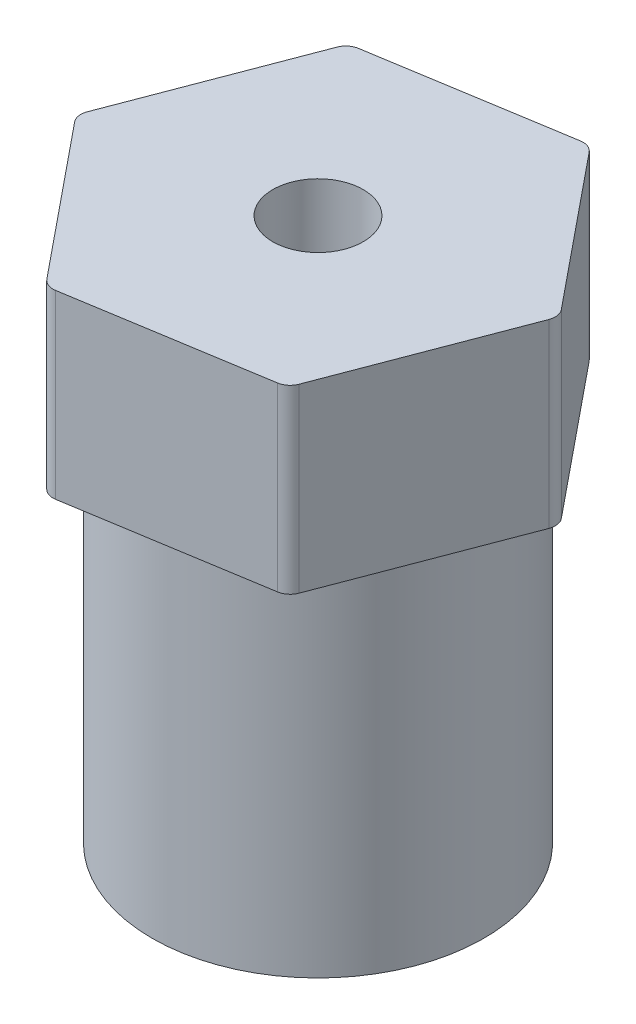
ISO-10303-21;
HEADER;
FILE_DESCRIPTION(('STEP AP214'),'2;1');
FILE_NAME('part.step','',(''),(''),'','','');
FILE_SCHEMA(('AUTOMOTIVE_DESIGN { 1 0 10303 214 1 1 1 1 }'));
ENDSEC;
DATA;
#1=APPLICATION_CONTEXT('core data for automotive mechanical design processes');
#2=APPLICATION_PROTOCOL_DEFINITION('international standard','automotive_design',2000,#1);
#3=PRODUCT_CONTEXT('',#1,'mechanical');
#4=PRODUCT('Part','Part','',(#3));
#5=PRODUCT_RELATED_PRODUCT_CATEGORY('part','',(#4));
#6=PRODUCT_DEFINITION_FORMATION('','',#4);
#7=PRODUCT_DEFINITION_CONTEXT('part definition',#1,'design');
#8=PRODUCT_DEFINITION('design','',#6,#7);
#9=PRODUCT_DEFINITION_SHAPE('','',#8);
#10=(LENGTH_UNIT() NAMED_UNIT(*) SI_UNIT(.MILLI.,.METRE.));
#11=(NAMED_UNIT(*) PLANE_ANGLE_UNIT() SI_UNIT($,.RADIAN.));
#12=(NAMED_UNIT(*) SI_UNIT($,.STERADIAN.) SOLID_ANGLE_UNIT());
#13=UNCERTAINTY_MEASURE_WITH_UNIT(LENGTH_MEASURE(1.E-05),#10,'distance_accuracy_value','');
#14=(GEOMETRIC_REPRESENTATION_CONTEXT(3) GLOBAL_UNCERTAINTY_ASSIGNED_CONTEXT((#13)) GLOBAL_UNIT_ASSIGNED_CONTEXT((#10,
#11,#12)) REPRESENTATION_CONTEXT('',''));
#15=CARTESIAN_POINT('',(0.,0.,0.));
#16=DIRECTION('',(0.,0.,1.));
#17=DIRECTION('',(1.,0.,0.));
#18=AXIS2_PLACEMENT_3D('',#15,#16,#17);
#19=CARTESIAN_POINT('',(0.,12.,0.));
#20=DIRECTION('',(0.,-1.,0.));
#21=DIRECTION('',(0.,0.,-1.));
#22=AXIS2_PLACEMENT_3D('',#19,#20,#21);
#23=CYLINDRICAL_SURFACE('',#22,5.5);
#24=CARTESIAN_POINT('',(0.,12.,0.));
#25=DIRECTION('',(0.,1.,0.));
#26=DIRECTION('',(0.,0.,1.));
#27=AXIS2_PLACEMENT_3D('',#24,#25,#26);
#28=CIRCLE('',#27,5.5);
#29=CARTESIAN_POINT('',(0.,12.,5.5));
#30=VERTEX_POINT('',#29);
#31=EDGE_CURVE('E162',#30,#30,#28,.T.);
#32=ORIENTED_EDGE('',*,*,#31,.F.);
#33=EDGE_LOOP('',(#32));
#34=FACE_BOUND('',#33,.T.);
#35=CARTESIAN_POINT('',(0.,0.,0.));
#36=DIRECTION('',(0.,1.,0.));
#37=DIRECTION('',(0.,0.,1.));
#38=AXIS2_PLACEMENT_3D('',#35,#36,#37);
#39=CIRCLE('',#38,5.5);
#40=CARTESIAN_POINT('',(0.,0.,5.5));
#41=VERTEX_POINT('',#40);
#42=EDGE_CURVE('E165',#41,#41,#39,.T.);
#43=ORIENTED_EDGE('',*,*,#42,.T.);
#44=EDGE_LOOP('',(#43));
#45=FACE_BOUND('',#44,.T.);
#46=ADVANCED_FACE('F39',(#34,#45),#23,.T.);
#47=CARTESIAN_POINT('',(0.,0.,0.));
#48=DIRECTION('',(0.,1.,0.));
#49=DIRECTION('',(0.,0.,1.));
#50=AXIS2_PLACEMENT_3D('',#47,#48,#49);
#51=PLANE('',#50);
#52=CARTESIAN_POINT('',(0.,0.,0.));
#53=DIRECTION('',(0.,-1.,0.));
#54=DIRECTION('',(0.,0.,-1.));
#55=AXIS2_PLACEMENT_3D('',#52,#53,#54);
#56=CIRCLE('',#55,2.75);
#57=CARTESIAN_POINT('',(0.,0.,-2.75));
#58=VERTEX_POINT('',#57);
#59=EDGE_CURVE('E172',#58,#58,#56,.T.);
#60=ORIENTED_EDGE('',*,*,#59,.F.);
#61=EDGE_LOOP('',(#60));
#62=FACE_BOUND('',#61,.T.);
#63=ORIENTED_EDGE('',*,*,#42,.F.);
#64=EDGE_LOOP('',(#63));
#65=FACE_BOUND('',#64,.T.);
#66=ADVANCED_FACE('F272',(#62,#65),#51,.F.);
#67=CARTESIAN_POINT('',(-2.4893670214251,18.,6.54240413247616));
#68=DIRECTION('',(-0.159335283762962,0.,-0.987224527323028));
#69=DIRECTION('',(-0.987224527323028,0.,0.159335283762962));
#70=AXIS2_PLACEMENT_3D('',#67,#68,#69);
#71=PLANE('',#70);
#72=DIRECTION('',(0.987224527323028,0.,-0.159335283762962));
#73=VECTOR('',#72,1.);
#74=CARTESIAN_POINT('',(-2.4893670214251,12.,6.54240413247616));
#75=LINE('',#74,#73);
#76=CARTESIAN_POINT('',(-2.20437984812483,12.,6.49640799799018));
#77=VERTEX_POINT('',#76);
#78=CARTESIAN_POINT('',(4.13621749653582,12.,5.4730532806214));
#79=VERTEX_POINT('',#78);
#80=EDGE_CURVE('E217',#77,#79,#75,.T.);
#81=ORIENTED_EDGE('',*,*,#80,.T.);
#82=DIRECTION('',(0.,-1.,0.));
#83=VECTOR('',#82,1.);
#84=CARTESIAN_POINT('',(4.13621749653582,18.,5.4730532806214));
#85=LINE('',#84,#83);
#86=CARTESIAN_POINT('',(4.13621749653582,18.,5.4730532806214));
#87=VERTEX_POINT('',#86);
#88=EDGE_CURVE('E210',#79,#87,#85,.F.);
#89=ORIENTED_EDGE('',*,*,#88,.T.);
#90=DIRECTION('',(0.987224527323028,0.,-0.159335283762962));
#91=VECTOR('',#90,1.);
#92=CARTESIAN_POINT('',(-2.4893670214251,18.,6.54240413247616));
#93=LINE('',#92,#91);
#94=CARTESIAN_POINT('',(-2.20437984812483,18.,6.49640799799018));
#95=VERTEX_POINT('',#94);
#96=EDGE_CURVE('E156',#95,#87,#93,.T.);
#97=ORIENTED_EDGE('',*,*,#96,.F.);
#98=DIRECTION('',(0.,-1.,0.));
#99=VECTOR('',#98,1.);
#100=CARTESIAN_POINT('',(-2.20437984812483,18.,6.49640799799018));
#101=LINE('',#100,#99);
#102=EDGE_CURVE('E207',#95,#77,#101,.T.);
#103=ORIENTED_EDGE('',*,*,#102,.T.);
#104=EDGE_LOOP('',(#81,#89,#97,#103));
#105=FACE_BOUND('',#104,.T.);
#106=ADVANCED_FACE('F224',(#105),#71,.F.);
#107=CARTESIAN_POINT('',(4.42120466983609,18.,5.42705714613542));
#108=DIRECTION('',(-0.934629161782308,0.,-0.355623860203586));
#109=DIRECTION('',(-0.355623860203586,0.,0.934629161782308));
#110=AXIS2_PLACEMENT_3D('',#107,#108,#109);
#111=PLANE('',#110);
#112=DIRECTION('',(0.355623860203586,0.,-0.934629161782308));
#113=VECTOR('',#112,1.);
#114=CARTESIAN_POINT('',(4.42120466983609,12.,5.42705714613542));
#115=LINE('',#114,#113);
#116=CARTESIAN_POINT('',(4.52386443554549,12.,5.15725294706168));
#117=VERTEX_POINT('',#116);
#118=CARTESIAN_POINT('',(6.8079119255518,12.,-0.845542787266992));
#119=VERTEX_POINT('',#118);
#120=EDGE_CURVE('E245',#117,#119,#115,.T.);
#121=ORIENTED_EDGE('',*,*,#120,.T.);
#122=DIRECTION('',(0.,-1.,0.));
#123=VECTOR('',#122,1.);
#124=CARTESIAN_POINT('',(6.8079119255518,18.,-0.845542787266992));
#125=LINE('',#124,#123);
#126=CARTESIAN_POINT('',(6.8079119255518,18.,-0.845542787266992));
#127=VERTEX_POINT('',#126);
#128=EDGE_CURVE('E205',#119,#127,#125,.F.);
#129=ORIENTED_EDGE('',*,*,#128,.T.);
#130=DIRECTION('',(0.355623860203586,0.,-0.934629161782308));
#131=VECTOR('',#130,1.);
#132=CARTESIAN_POINT('',(4.42120466983609,18.,5.42705714613542));
#133=LINE('',#132,#131);
#134=CARTESIAN_POINT('',(4.52386443554549,18.,5.15725294706168));
#135=VERTEX_POINT('',#134);
#136=EDGE_CURVE('E228',#135,#127,#133,.T.);
#137=ORIENTED_EDGE('',*,*,#136,.F.);
#138=DIRECTION('',(0.,-1.,0.));
#139=VECTOR('',#138,1.);
#140=CARTESIAN_POINT('',(4.52386443554549,18.,5.15725294706168));
#141=LINE('',#140,#139);
#142=EDGE_CURVE('E202',#135,#117,#141,.T.);
#143=ORIENTED_EDGE('',*,*,#142,.T.);
#144=EDGE_LOOP('',(#121,#129,#137,#143));
#145=FACE_BOUND('',#144,.T.);
#146=ADVANCED_FACE('F269',(#145),#111,.F.);
#147=CARTESIAN_POINT('',(6.9105716912612,18.,-1.11534698634074));
#148=DIRECTION('',(-0.775293878019346,0.,0.631600667119442));
#149=DIRECTION('',(0.631600667119442,0.,0.775293878019346));
#150=AXIS2_PLACEMENT_3D('',#147,#148,#149);
#151=PLANE('',#150);
#152=DIRECTION('',(-0.631600667119442,0.,-0.775293878019346));
#153=VECTOR('',#152,1.);
#154=CARTESIAN_POINT('',(6.9105716912612,12.,-1.11534698634074));
#155=LINE('',#154,#153);
#156=CARTESIAN_POINT('',(6.72824428367032,12.,-1.33915505092851));
#157=VERTEX_POINT('',#156);
#158=CARTESIAN_POINT('',(2.67169442901598,12.,-6.31859606788839));
#159=VERTEX_POINT('',#158);
#160=EDGE_CURVE('E158',#157,#159,#155,.T.);
#161=ORIENTED_EDGE('',*,*,#160,.T.);
#162=DIRECTION('',(0.,-1.,0.));
#163=VECTOR('',#162,1.);
#164=CARTESIAN_POINT('',(2.67169442901598,18.,-6.31859606788839));
#165=LINE('',#164,#163);
#166=CARTESIAN_POINT('',(2.67169442901598,18.,-6.31859606788839));
#167=VERTEX_POINT('',#166);
#168=EDGE_CURVE('E200',#159,#167,#165,.F.);
#169=ORIENTED_EDGE('',*,*,#168,.T.);
#170=DIRECTION('',(-0.631600667119442,0.,-0.775293878019346));
#171=VECTOR('',#170,1.);
#172=CARTESIAN_POINT('',(6.9105716912612,18.,-1.11534698634074));
#173=LINE('',#172,#171);
#174=CARTESIAN_POINT('',(6.72824428367032,18.,-1.33915505092851));
#175=VERTEX_POINT('',#174);
#176=EDGE_CURVE('E231',#175,#167,#173,.T.);
#177=ORIENTED_EDGE('',*,*,#176,.F.);
#178=DIRECTION('',(0.,-1.,0.));
#179=VECTOR('',#178,1.);
#180=CARTESIAN_POINT('',(6.72824428367032,18.,-1.33915505092851));
#181=LINE('',#180,#179);
#182=EDGE_CURVE('E197',#175,#157,#181,.T.);
#183=ORIENTED_EDGE('',*,*,#182,.T.);
#184=EDGE_LOOP('',(#161,#169,#177,#183));
#185=FACE_BOUND('',#184,.T.);
#186=ADVANCED_FACE('F251',(#185),#151,.F.);
#187=CARTESIAN_POINT('',(2.4893670214251,18.,-6.54240413247616));
#188=DIRECTION('',(0.159335283762962,0.,0.987224527323028));
#189=DIRECTION('',(0.987224527323028,0.,-0.159335283762962));
#190=AXIS2_PLACEMENT_3D('',#187,#188,#189);
#191=PLANE('',#190);
#192=DIRECTION('',(-0.987224527323028,0.,0.159335283762962));
#193=VECTOR('',#192,1.);
#194=CARTESIAN_POINT('',(2.4893670214251,12.,-6.54240413247616));
#195=LINE('',#194,#193);
#196=CARTESIAN_POINT('',(2.20437984812483,12.,-6.49640799799018));
#197=VERTEX_POINT('',#196);
#198=CARTESIAN_POINT('',(-4.13621749653581,12.,-5.4730532806214));
#199=VERTEX_POINT('',#198);
#200=EDGE_CURVE('E154',#197,#199,#195,.T.);
#201=ORIENTED_EDGE('',*,*,#200,.T.);
#202=DIRECTION('',(0.,-1.,0.));
#203=VECTOR('',#202,1.);
#204=CARTESIAN_POINT('',(-4.13621749653582,18.,-5.4730532806214));
#205=LINE('',#204,#203);
#206=CARTESIAN_POINT('',(-4.13621749653581,18.,-5.4730532806214));
#207=VERTEX_POINT('',#206);
#208=EDGE_CURVE('E133',#199,#207,#205,.F.);
#209=ORIENTED_EDGE('',*,*,#208,.T.);
#210=DIRECTION('',(-0.987224527323028,0.,0.159335283762962));
#211=VECTOR('',#210,1.);
#212=CARTESIAN_POINT('',(2.4893670214251,18.,-6.54240413247616));
#213=LINE('',#212,#211);
#214=CARTESIAN_POINT('',(2.20437984812483,18.,-6.49640799799018));
#215=VERTEX_POINT('',#214);
#216=EDGE_CURVE('E239',#215,#207,#213,.T.);
#217=ORIENTED_EDGE('',*,*,#216,.F.);
#218=DIRECTION('',(0.,-1.,0.));
#219=VECTOR('',#218,1.);
#220=CARTESIAN_POINT('',(2.20437984812483,18.,-6.49640799799018));
#221=LINE('',#220,#219);
#222=EDGE_CURVE('E138',#215,#197,#221,.T.);
#223=ORIENTED_EDGE('',*,*,#222,.T.);
#224=EDGE_LOOP('',(#201,#209,#217,#223));
#225=FACE_BOUND('',#224,.T.);
#226=ADVANCED_FACE('F261',(#225),#191,.F.);
#227=CARTESIAN_POINT('',(-4.42120466983609,18.,-5.42705714613542));
#228=DIRECTION('',(0.934629161782308,0.,0.355623860203586));
#229=DIRECTION('',(0.355623860203586,0.,-0.934629161782308));
#230=AXIS2_PLACEMENT_3D('',#227,#228,#229);
#231=PLANE('',#230);
#232=DIRECTION('',(-0.355623860203586,0.,0.934629161782308));
#233=VECTOR('',#232,1.);
#234=CARTESIAN_POINT('',(-4.42120466983609,18.,-5.42705714613542));
#235=LINE('',#234,#233);
#236=CARTESIAN_POINT('',(-4.52386443554549,18.,-5.15725294706168));
#237=VERTEX_POINT('',#236);
#238=CARTESIAN_POINT('',(-6.8079119255518,18.,0.845542787266992));
#239=VERTEX_POINT('',#238);
#240=EDGE_CURVE('E147',#237,#239,#235,.T.);
#241=ORIENTED_EDGE('',*,*,#240,.F.);
#242=DIRECTION('',(0.,-1.,0.));
#243=VECTOR('',#242,1.);
#244=CARTESIAN_POINT('',(-4.52386443554549,18.,-5.15725294706168));
#245=LINE('',#244,#243);
#246=CARTESIAN_POINT('',(-4.52386443554549,12.,-5.15725294706168));
#247=VERTEX_POINT('',#246);
#248=EDGE_CURVE('E132',#237,#247,#245,.T.);
#249=ORIENTED_EDGE('',*,*,#248,.T.);
#250=DIRECTION('',(-0.355623860203586,0.,0.934629161782308));
#251=VECTOR('',#250,1.);
#252=CARTESIAN_POINT('',(-4.42120466983609,12.,-5.42705714613542));
#253=LINE('',#252,#251);
#254=CARTESIAN_POINT('',(-6.8079119255518,12.,0.845542787266992));
#255=VERTEX_POINT('',#254);
#256=EDGE_CURVE('E145',#247,#255,#253,.T.);
#257=ORIENTED_EDGE('',*,*,#256,.T.);
#258=DIRECTION('',(0.,-1.,0.));
#259=VECTOR('',#258,1.);
#260=CARTESIAN_POINT('',(-6.8079119255518,18.,0.845542787266992));
#261=LINE('',#260,#259);
#262=EDGE_CURVE('E149',#255,#239,#261,.F.);
#263=ORIENTED_EDGE('',*,*,#262,.T.);
#264=EDGE_LOOP('',(#241,#249,#257,#263));
#265=FACE_BOUND('',#264,.T.);
#266=ADVANCED_FACE('F144',(#265),#231,.F.);
#267=CARTESIAN_POINT('',(-6.9105716912612,18.,1.11534698634074));
#268=DIRECTION('',(0.775293878019346,0.,-0.631600667119442));
#269=DIRECTION('',(-0.631600667119442,0.,-0.775293878019346));
#270=AXIS2_PLACEMENT_3D('',#267,#268,#269);
#271=PLANE('',#270);
#272=DIRECTION('',(0.631600667119442,0.,0.775293878019346));
#273=VECTOR('',#272,1.);
#274=CARTESIAN_POINT('',(-6.9105716912612,12.,1.11534698634074));
#275=LINE('',#274,#273);
#276=CARTESIAN_POINT('',(-6.72824428367032,12.,1.33915505092851));
#277=VERTEX_POINT('',#276);
#278=CARTESIAN_POINT('',(-2.67169442901598,12.,6.31859606788839));
#279=VERTEX_POINT('',#278);
#280=EDGE_CURVE('E153',#277,#279,#275,.T.);
#281=ORIENTED_EDGE('',*,*,#280,.T.);
#282=DIRECTION('',(0.,-1.,0.));
#283=VECTOR('',#282,1.);
#284=CARTESIAN_POINT('',(-2.67169442901598,18.,6.31859606788839));
#285=LINE('',#284,#283);
#286=CARTESIAN_POINT('',(-2.67169442901598,18.,6.31859606788839));
#287=VERTEX_POINT('',#286);
#288=EDGE_CURVE('E11',#279,#287,#285,.F.);
#289=ORIENTED_EDGE('',*,*,#288,.T.);
#290=DIRECTION('',(0.631600667119442,0.,0.775293878019346));
#291=VECTOR('',#290,1.);
#292=CARTESIAN_POINT('',(-6.9105716912612,18.,1.11534698634074));
#293=LINE('',#292,#291);
#294=CARTESIAN_POINT('',(-6.72824428367032,18.,1.33915505092851));
#295=VERTEX_POINT('',#294);
#296=EDGE_CURVE('E168',#295,#287,#293,.T.);
#297=ORIENTED_EDGE('',*,*,#296,.F.);
#298=DIRECTION('',(0.,-1.,0.));
#299=VECTOR('',#298,1.);
#300=CARTESIAN_POINT('',(-6.72824428367032,18.,1.33915505092851));
#301=LINE('',#300,#299);
#302=EDGE_CURVE('E47',#295,#277,#301,.T.);
#303=ORIENTED_EDGE('',*,*,#302,.T.);
#304=EDGE_LOOP('',(#281,#289,#297,#303));
#305=FACE_BOUND('',#304,.T.);
#306=ADVANCED_FACE('F213',(#305),#271,.F.);
#307=CARTESIAN_POINT('',(0.,18.,0.));
#308=DIRECTION('',(0.,1.,0.));
#309=DIRECTION('',(0.,0.,1.));
#310=AXIS2_PLACEMENT_3D('',#307,#308,#309);
#311=PLANE('',#310);
#312=CARTESIAN_POINT('',(0.,18.,0.));
#313=DIRECTION('',(0.,1.,0.));
#314=DIRECTION('',(0.,0.,1.));
#315=AXIS2_PLACEMENT_3D('',#312,#313,#314);
#316=CIRCLE('',#315,1.5);
#317=CARTESIAN_POINT('',(0.,18.,1.5));
#318=VERTEX_POINT('',#317);
#319=EDGE_CURVE('E173',#318,#318,#316,.T.);
#320=ORIENTED_EDGE('',*,*,#319,.F.);
#321=EDGE_LOOP('',(#320));
#322=FACE_BOUND('',#321,.T.);
#323=ORIENTED_EDGE('',*,*,#216,.T.);
#324=CARTESIAN_POINT('',(-4.05654985465433,18.,-4.97944101695988));
#325=DIRECTION('',(0.,1.,0.));
#326=DIRECTION('',(0.,0.,1.));
#327=AXIS2_PLACEMENT_3D('',#324,#325,#326);
#328=CIRCLE('',#327,0.5);
#329=EDGE_CURVE('E195',#207,#237,#328,.T.);
#330=ORIENTED_EDGE('',*,*,#329,.T.);
#331=ORIENTED_EDGE('',*,*,#240,.T.);
#332=CARTESIAN_POINT('',(-6.34059734466065,18.,1.02335471736879));
#333=DIRECTION('',(0.,1.,0.));
#334=DIRECTION('',(0.,0.,1.));
#335=AXIS2_PLACEMENT_3D('',#332,#333,#334);
#336=CIRCLE('',#335,0.5);
#337=EDGE_CURVE('E59',#239,#295,#336,.T.);
#338=ORIENTED_EDGE('',*,*,#337,.T.);
#339=ORIENTED_EDGE('',*,*,#296,.T.);
#340=CARTESIAN_POINT('',(-2.28404749000631,18.,6.00279573432867));
#341=DIRECTION('',(0.,1.,0.));
#342=DIRECTION('',(0.,0.,1.));
#343=AXIS2_PLACEMENT_3D('',#340,#341,#342);
#344=CIRCLE('',#343,0.5);
#345=EDGE_CURVE('E187',#287,#95,#344,.T.);
#346=ORIENTED_EDGE('',*,*,#345,.T.);
#347=ORIENTED_EDGE('',*,*,#96,.T.);
#348=CARTESIAN_POINT('',(4.05654985465434,18.,4.97944101695988));
#349=DIRECTION('',(0.,1.,0.));
#350=DIRECTION('',(0.,0.,1.));
#351=AXIS2_PLACEMENT_3D('',#348,#349,#350);
#352=CIRCLE('',#351,0.5);
#353=EDGE_CURVE('E189',#87,#135,#352,.T.);
#354=ORIENTED_EDGE('',*,*,#353,.T.);
#355=ORIENTED_EDGE('',*,*,#136,.T.);
#356=CARTESIAN_POINT('',(6.34059734466065,18.,-1.02335471736879));
#357=DIRECTION('',(0.,1.,0.));
#358=DIRECTION('',(0.,0.,1.));
#359=AXIS2_PLACEMENT_3D('',#356,#357,#358);
#360=CIRCLE('',#359,0.5);
#361=EDGE_CURVE('E191',#127,#175,#360,.T.);
#362=ORIENTED_EDGE('',*,*,#361,.T.);
#363=ORIENTED_EDGE('',*,*,#176,.T.);
#364=CARTESIAN_POINT('',(2.28404749000631,18.,-6.00279573432867));
#365=DIRECTION('',(0.,1.,0.));
#366=DIRECTION('',(0.,0.,1.));
#367=AXIS2_PLACEMENT_3D('',#364,#365,#366);
#368=CIRCLE('',#367,0.5);
#369=EDGE_CURVE('E193',#167,#215,#368,.T.);
#370=ORIENTED_EDGE('',*,*,#369,.T.);
#371=EDGE_LOOP('',(#323,#330,#331,#338,#339,#346,#347,#354,#355,#362,#363,#370));
#372=FACE_BOUND('',#371,.T.);
#373=ADVANCED_FACE('F259',(#322,#372),#311,.T.);
#374=CARTESIAN_POINT('',(0.,12.,0.));
#375=DIRECTION('',(0.,1.,0.));
#376=DIRECTION('',(0.,0.,1.));
#377=AXIS2_PLACEMENT_3D('',#374,#375,#376);
#378=PLANE('',#377);
#379=ORIENTED_EDGE('',*,*,#31,.T.);
#380=EDGE_LOOP('',(#379));
#381=FACE_BOUND('',#380,.T.);
#382=ORIENTED_EDGE('',*,*,#256,.F.);
#383=CARTESIAN_POINT('',(-4.05654985465433,12.,-4.97944101695988));
#384=DIRECTION('',(0.,1.,0.));
#385=DIRECTION('',(0.,0.,1.));
#386=AXIS2_PLACEMENT_3D('',#383,#384,#385);
#387=CIRCLE('',#386,0.5);
#388=EDGE_CURVE('E128',#247,#199,#387,.F.);
#389=ORIENTED_EDGE('',*,*,#388,.T.);
#390=ORIENTED_EDGE('',*,*,#200,.F.);
#391=CARTESIAN_POINT('',(2.28404749000631,12.,-6.00279573432867));
#392=DIRECTION('',(0.,1.,0.));
#393=DIRECTION('',(0.,0.,1.));
#394=AXIS2_PLACEMENT_3D('',#391,#392,#393);
#395=CIRCLE('',#394,0.5);
#396=EDGE_CURVE('E139',#197,#159,#395,.F.);
#397=ORIENTED_EDGE('',*,*,#396,.T.);
#398=ORIENTED_EDGE('',*,*,#160,.F.);
#399=CARTESIAN_POINT('',(6.34059734466065,12.,-1.02335471736879));
#400=DIRECTION('',(0.,1.,0.));
#401=DIRECTION('',(0.,0.,1.));
#402=AXIS2_PLACEMENT_3D('',#399,#400,#401);
#403=CIRCLE('',#402,0.5);
#404=EDGE_CURVE('E180',#157,#119,#403,.F.);
#405=ORIENTED_EDGE('',*,*,#404,.T.);
#406=ORIENTED_EDGE('',*,*,#120,.F.);
#407=CARTESIAN_POINT('',(4.05654985465434,12.,4.97944101695988));
#408=DIRECTION('',(0.,1.,0.));
#409=DIRECTION('',(0.,0.,1.));
#410=AXIS2_PLACEMENT_3D('',#407,#408,#409);
#411=CIRCLE('',#410,0.5);
#412=EDGE_CURVE('E178',#117,#79,#411,.F.);
#413=ORIENTED_EDGE('',*,*,#412,.T.);
#414=ORIENTED_EDGE('',*,*,#80,.F.);
#415=CARTESIAN_POINT('',(-2.28404749000631,12.,6.00279573432867));
#416=DIRECTION('',(0.,1.,0.));
#417=DIRECTION('',(0.,0.,1.));
#418=AXIS2_PLACEMENT_3D('',#415,#416,#417);
#419=CIRCLE('',#418,0.5);
#420=EDGE_CURVE('E176',#77,#279,#419,.F.);
#421=ORIENTED_EDGE('',*,*,#420,.T.);
#422=ORIENTED_EDGE('',*,*,#280,.F.);
#423=CARTESIAN_POINT('',(-6.34059734466065,12.,1.02335471736879));
#424=DIRECTION('',(0.,1.,0.));
#425=DIRECTION('',(0.,0.,1.));
#426=AXIS2_PLACEMENT_3D('',#423,#424,#425);
#427=CIRCLE('',#426,0.5);
#428=EDGE_CURVE('E148',#277,#255,#427,.F.);
#429=ORIENTED_EDGE('',*,*,#428,.T.);
#430=EDGE_LOOP('',(#382,#389,#390,#397,#398,#405,#406,#413,#414,#421,#422,#429));
#431=FACE_BOUND('',#430,.T.);
#432=ADVANCED_FACE('F151',(#381,#431),#378,.F.);
#433=CARTESIAN_POINT('',(0.,12.,0.));
#434=DIRECTION('',(0.,-1.,0.));
#435=DIRECTION('',(0.,0.,-1.));
#436=AXIS2_PLACEMENT_3D('',#433,#434,#435);
#437=CONICAL_SURFACE('',#436,2.75,1.02974425867665);
#438=CARTESIAN_POINT('',(0.,12.7510757737845,0.));
#439=DIRECTION('',(0.,-1.,0.));
#440=DIRECTION('',(0.,0.,-1.));
#441=AXIS2_PLACEMENT_3D('',#438,#439,#440);
#442=CIRCLE('',#441,1.5);
#443=CARTESIAN_POINT('',(0.,12.7510757737845,-1.5));
#444=VERTEX_POINT('',#443);
#445=EDGE_CURVE('E169',#444,#444,#442,.F.);
#446=ORIENTED_EDGE('',*,*,#445,.T.);
#447=EDGE_LOOP('',(#446));
#448=FACE_BOUND('',#447,.T.);
#449=CARTESIAN_POINT('',(0.,12.,0.));
#450=DIRECTION('',(0.,-1.,0.));
#451=DIRECTION('',(0.,0.,-1.));
#452=AXIS2_PLACEMENT_3D('',#449,#450,#451);
#453=CIRCLE('',#452,2.75);
#454=CARTESIAN_POINT('',(0.,12.,-2.75));
#455=VERTEX_POINT('',#454);
#456=EDGE_CURVE('E234',#455,#455,#453,.T.);
#457=ORIENTED_EDGE('',*,*,#456,.T.);
#458=EDGE_LOOP('',(#457));
#459=FACE_BOUND('',#458,.T.);
#460=ADVANCED_FACE('F352',(#448,#459),#437,.F.);
#461=CARTESIAN_POINT('',(0.,0.,0.));
#462=DIRECTION('',(0.,-1.,0.));
#463=DIRECTION('',(0.,0.,-1.));
#464=AXIS2_PLACEMENT_3D('',#461,#462,#463);
#465=CYLINDRICAL_SURFACE('',#464,2.75);
#466=ORIENTED_EDGE('',*,*,#456,.F.);
#467=EDGE_LOOP('',(#466));
#468=FACE_BOUND('',#467,.T.);
#469=ORIENTED_EDGE('',*,*,#59,.T.);
#470=EDGE_LOOP('',(#469));
#471=FACE_BOUND('',#470,.T.);
#472=ADVANCED_FACE('F340',(#468,#471),#465,.F.);
#473=CARTESIAN_POINT('',(0.,18.,0.));
#474=DIRECTION('',(0.,1.,0.));
#475=DIRECTION('',(0.,0.,1.));
#476=AXIS2_PLACEMENT_3D('',#473,#474,#475);
#477=CYLINDRICAL_SURFACE('',#476,1.5);
#478=ORIENTED_EDGE('',*,*,#319,.T.);
#479=EDGE_LOOP('',(#478));
#480=FACE_BOUND('',#479,.T.);
#481=ORIENTED_EDGE('',*,*,#445,.F.);
#482=EDGE_LOOP('',(#481));
#483=FACE_BOUND('',#482,.T.);
#484=ADVANCED_FACE('F286',(#480,#483),#477,.F.);
#485=CARTESIAN_POINT('',(-4.05654985465433,18.,-4.97944101695988));
#486=DIRECTION('',(0.,-1.,0.));
#487=DIRECTION('',(0.,0.,-1.));
#488=AXIS2_PLACEMENT_3D('',#485,#486,#487);
#489=CYLINDRICAL_SURFACE('',#488,0.5);
#490=ORIENTED_EDGE('',*,*,#329,.F.);
#491=ORIENTED_EDGE('',*,*,#208,.F.);
#492=ORIENTED_EDGE('',*,*,#388,.F.);
#493=ORIENTED_EDGE('',*,*,#248,.F.);
#494=EDGE_LOOP('',(#490,#491,#492,#493));
#495=FACE_BOUND('',#494,.T.);
#496=ADVANCED_FACE('F131',(#495),#489,.T.);
#497=CARTESIAN_POINT('',(2.28404749000631,18.,-6.00279573432867));
#498=DIRECTION('',(0.,-1.,0.));
#499=DIRECTION('',(0.,0.,-1.));
#500=AXIS2_PLACEMENT_3D('',#497,#498,#499);
#501=CYLINDRICAL_SURFACE('',#500,0.5);
#502=ORIENTED_EDGE('',*,*,#369,.F.);
#503=ORIENTED_EDGE('',*,*,#168,.F.);
#504=ORIENTED_EDGE('',*,*,#396,.F.);
#505=ORIENTED_EDGE('',*,*,#222,.F.);
#506=EDGE_LOOP('',(#502,#503,#504,#505));
#507=FACE_BOUND('',#506,.T.);
#508=ADVANCED_FACE('F256',(#507),#501,.T.);
#509=CARTESIAN_POINT('',(6.34059734466065,18.,-1.02335471736879));
#510=DIRECTION('',(0.,-1.,0.));
#511=DIRECTION('',(0.,0.,-1.));
#512=AXIS2_PLACEMENT_3D('',#509,#510,#511);
#513=CYLINDRICAL_SURFACE('',#512,0.5);
#514=ORIENTED_EDGE('',*,*,#361,.F.);
#515=ORIENTED_EDGE('',*,*,#128,.F.);
#516=ORIENTED_EDGE('',*,*,#404,.F.);
#517=ORIENTED_EDGE('',*,*,#182,.F.);
#518=EDGE_LOOP('',(#514,#515,#516,#517));
#519=FACE_BOUND('',#518,.T.);
#520=ADVANCED_FACE('F289',(#519),#513,.T.);
#521=CARTESIAN_POINT('',(4.05654985465434,18.,4.97944101695988));
#522=DIRECTION('',(0.,-1.,0.));
#523=DIRECTION('',(0.,0.,-1.));
#524=AXIS2_PLACEMENT_3D('',#521,#522,#523);
#525=CYLINDRICAL_SURFACE('',#524,0.5);
#526=ORIENTED_EDGE('',*,*,#353,.F.);
#527=ORIENTED_EDGE('',*,*,#88,.F.);
#528=ORIENTED_EDGE('',*,*,#412,.F.);
#529=ORIENTED_EDGE('',*,*,#142,.F.);
#530=EDGE_LOOP('',(#526,#527,#528,#529));
#531=FACE_BOUND('',#530,.T.);
#532=ADVANCED_FACE('F292',(#531),#525,.T.);
#533=CARTESIAN_POINT('',(-2.28404749000631,18.,6.00279573432867));
#534=DIRECTION('',(0.,-1.,0.));
#535=DIRECTION('',(0.,0.,-1.));
#536=AXIS2_PLACEMENT_3D('',#533,#534,#535);
#537=CYLINDRICAL_SURFACE('',#536,0.5);
#538=ORIENTED_EDGE('',*,*,#345,.F.);
#539=ORIENTED_EDGE('',*,*,#288,.F.);
#540=ORIENTED_EDGE('',*,*,#420,.F.);
#541=ORIENTED_EDGE('',*,*,#102,.F.);
#542=EDGE_LOOP('',(#538,#539,#540,#541));
#543=FACE_BOUND('',#542,.T.);
#544=ADVANCED_FACE('F221',(#543),#537,.T.);
#545=CARTESIAN_POINT('',(-6.34059734466065,18.,1.02335471736879));
#546=DIRECTION('',(0.,-1.,0.));
#547=DIRECTION('',(0.,0.,-1.));
#548=AXIS2_PLACEMENT_3D('',#545,#546,#547);
#549=CYLINDRICAL_SURFACE('',#548,0.5);
#550=ORIENTED_EDGE('',*,*,#337,.F.);
#551=ORIENTED_EDGE('',*,*,#262,.F.);
#552=ORIENTED_EDGE('',*,*,#428,.F.);
#553=ORIENTED_EDGE('',*,*,#302,.F.);
#554=EDGE_LOOP('',(#550,#551,#552,#553));
#555=FACE_BOUND('',#554,.T.);
#556=ADVANCED_FACE('F41',(#555),#549,.T.);
#557=CLOSED_SHELL('',(#46,#66,#106,#146,#186,#226,#266,#306,#373,#432,#460,#472,#484,#496,#508,
#520,#532,#544,#556));
#558=MANIFOLD_SOLID_BREP('B2',#557);
#559=ADVANCED_BREP_SHAPE_REPRESENTATION('',(#18,#558),#14);
#560=SHAPE_DEFINITION_REPRESENTATION(#9,#559);
ENDSEC;
END-ISO-10303-21;
